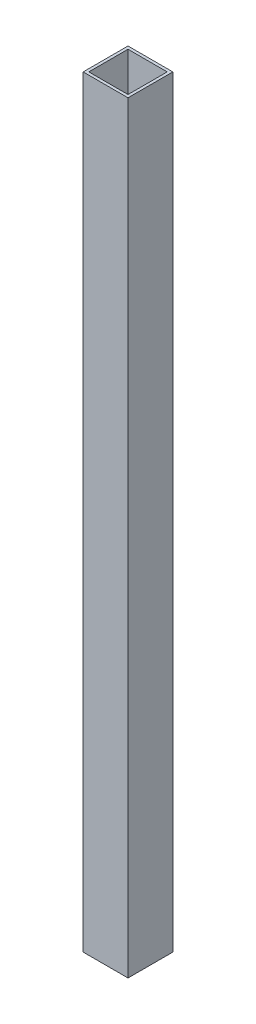
ISO-10303-21;
HEADER;
FILE_DESCRIPTION(('STEP AP214'),'2;1');
FILE_NAME('part.step','',(''),(''),'','','');
FILE_SCHEMA(('AUTOMOTIVE_DESIGN { 1 0 10303 214 1 1 1 1 }'));
ENDSEC;
DATA;
#1=APPLICATION_CONTEXT('core data for automotive mechanical design processes');
#2=APPLICATION_PROTOCOL_DEFINITION('international standard','automotive_design',2000,#1);
#3=PRODUCT_CONTEXT('',#1,'mechanical');
#4=PRODUCT('Part','Part','',(#3));
#5=PRODUCT_RELATED_PRODUCT_CATEGORY('part','',(#4));
#6=PRODUCT_DEFINITION_FORMATION('','',#4);
#7=PRODUCT_DEFINITION_CONTEXT('part definition',#1,'design');
#8=PRODUCT_DEFINITION('design','',#6,#7);
#9=PRODUCT_DEFINITION_SHAPE('','',#8);
#10=(LENGTH_UNIT() NAMED_UNIT(*) SI_UNIT(.MILLI.,.METRE.));
#11=(NAMED_UNIT(*) PLANE_ANGLE_UNIT() SI_UNIT($,.RADIAN.));
#12=(NAMED_UNIT(*) SI_UNIT($,.STERADIAN.) SOLID_ANGLE_UNIT());
#13=UNCERTAINTY_MEASURE_WITH_UNIT(LENGTH_MEASURE(1.E-05),#10,'distance_accuracy_value','');
#14=(GEOMETRIC_REPRESENTATION_CONTEXT(3) GLOBAL_UNCERTAINTY_ASSIGNED_CONTEXT((#13)) GLOBAL_UNIT_ASSIGNED_CONTEXT((#10,
#11,#12)) REPRESENTATION_CONTEXT('',''));
#15=CARTESIAN_POINT('',(0.,0.,0.));
#16=DIRECTION('',(0.,0.,1.));
#17=DIRECTION('',(1.,0.,0.));
#18=AXIS2_PLACEMENT_3D('',#15,#16,#17);
#19=CARTESIAN_POINT('',(1.66533453693773E-13,431.8,0.));
#20=DIRECTION('',(0.,-1.,0.));
#21=DIRECTION('',(0.,0.,-1.));
#22=AXIS2_PLACEMENT_3D('',#19,#20,#21);
#23=PLANE('',#22);
#24=DIRECTION('',(0.,0.,1.));
#25=VECTOR('',#24,1.);
#26=CARTESIAN_POINT('',(-12.6999999999999,431.8,-12.6999999999999));
#27=LINE('',#26,#25);
#28=CARTESIAN_POINT('',(-12.6999999999999,431.8,-12.6999999999999));
#29=VERTEX_POINT('',#28);
#30=CARTESIAN_POINT('',(-12.7,431.8,12.7000000000002));
#31=VERTEX_POINT('',#30);
#32=EDGE_CURVE('E131',#29,#31,#27,.T.);
#33=ORIENTED_EDGE('',*,*,#32,.T.);
#34=DIRECTION('',(0.999999999999999,0.,0.));
#35=VECTOR('',#34,1.);
#36=CARTESIAN_POINT('',(12.7,431.8,12.7000000000002));
#37=LINE('',#36,#35);
#38=CARTESIAN_POINT('',(12.7,431.8,12.7000000000002));
#39=VERTEX_POINT('',#38);
#40=EDGE_CURVE('E134',#31,#39,#37,.T.);
#41=ORIENTED_EDGE('',*,*,#40,.T.);
#42=DIRECTION('',(0.,0.,-1.));
#43=VECTOR('',#42,1.);
#44=CARTESIAN_POINT('',(12.7,431.8,-12.6999999999999));
#45=LINE('',#44,#43);
#46=CARTESIAN_POINT('',(12.7,431.8,-12.6999999999999));
#47=VERTEX_POINT('',#46);
#48=EDGE_CURVE('E137',#39,#47,#45,.T.);
#49=ORIENTED_EDGE('',*,*,#48,.T.);
#50=DIRECTION('',(-0.999999999999999,0.,0.));
#51=VECTOR('',#50,1.);
#52=CARTESIAN_POINT('',(12.7,431.8,-12.6999999999999));
#53=LINE('',#52,#51);
#54=EDGE_CURVE('E139',#47,#29,#53,.T.);
#55=ORIENTED_EDGE('',*,*,#54,.T.);
#56=EDGE_LOOP('',(#33,#41,#49,#55));
#57=FACE_BOUND('',#56,.T.);
#58=DIRECTION('',(0.,0.,1.));
#59=VECTOR('',#58,1.);
#60=CARTESIAN_POINT('',(-11.1124999999999,431.8,-11.1124999999999));
#61=LINE('',#60,#59);
#62=CARTESIAN_POINT('',(-11.1124999999999,431.8,-11.1124999999999));
#63=VERTEX_POINT('',#62);
#64=CARTESIAN_POINT('',(-11.1125,431.8,11.1125000000001));
#65=VERTEX_POINT('',#64);
#66=EDGE_CURVE('E95',#63,#65,#61,.T.);
#67=ORIENTED_EDGE('',*,*,#66,.F.);
#68=DIRECTION('',(-0.999999999999999,0.,0.));
#69=VECTOR('',#68,1.);
#70=CARTESIAN_POINT('',(11.1125,431.8,-11.1124999999999));
#71=LINE('',#70,#69);
#72=CARTESIAN_POINT('',(11.1125,431.8,-11.1124999999999));
#73=VERTEX_POINT('',#72);
#74=EDGE_CURVE('E117',#73,#63,#71,.T.);
#75=ORIENTED_EDGE('',*,*,#74,.F.);
#76=DIRECTION('',(0.,0.,-1.));
#77=VECTOR('',#76,1.);
#78=CARTESIAN_POINT('',(11.1125,431.8,-11.1124999999999));
#79=LINE('',#78,#77);
#80=CARTESIAN_POINT('',(11.1125,431.8,11.1125000000001));
#81=VERTEX_POINT('',#80);
#82=EDGE_CURVE('E115',#81,#73,#79,.T.);
#83=ORIENTED_EDGE('',*,*,#82,.F.);
#84=DIRECTION('',(0.999999999999999,0.,0.));
#85=VECTOR('',#84,1.);
#86=CARTESIAN_POINT('',(11.1125,431.8,11.1125000000001));
#87=LINE('',#86,#85);
#88=EDGE_CURVE('E103',#65,#81,#87,.T.);
#89=ORIENTED_EDGE('',*,*,#88,.F.);
#90=EDGE_LOOP('',(#67,#75,#83,#89));
#91=FACE_BOUND('',#90,.T.);
#92=ADVANCED_FACE('F30',(#57,#91),#23,.F.);
#93=CARTESIAN_POINT('',(0.,0.,0.));
#94=DIRECTION('',(0.,-1.,0.));
#95=DIRECTION('',(0.,0.,-1.));
#96=AXIS2_PLACEMENT_3D('',#93,#94,#95);
#97=PLANE('',#96);
#98=DIRECTION('',(0.,0.,1.));
#99=VECTOR('',#98,1.);
#100=CARTESIAN_POINT('',(-12.7,-6.66133814775094E-13,-12.6999999999999));
#101=LINE('',#100,#99);
#102=CARTESIAN_POINT('',(-12.7,-6.66133814775094E-13,-12.6999999999999));
#103=VERTEX_POINT('',#102);
#104=CARTESIAN_POINT('',(-12.7000000000002,0.,12.6999999999999));
#105=VERTEX_POINT('',#104);
#106=EDGE_CURVE('E111',#103,#105,#101,.T.);
#107=ORIENTED_EDGE('',*,*,#106,.F.);
#108=DIRECTION('',(-0.999999999999999,0.,0.));
#109=VECTOR('',#108,1.);
#110=CARTESIAN_POINT('',(12.7,0.,-12.6999999999999));
#111=LINE('',#110,#109);
#112=CARTESIAN_POINT('',(12.7,0.,-12.6999999999999));
#113=VERTEX_POINT('',#112);
#114=EDGE_CURVE('E135',#113,#103,#111,.T.);
#115=ORIENTED_EDGE('',*,*,#114,.F.);
#116=DIRECTION('',(0.,0.,-1.));
#117=VECTOR('',#116,1.);
#118=CARTESIAN_POINT('',(12.7,0.,-12.6999999999999));
#119=LINE('',#118,#117);
#120=CARTESIAN_POINT('',(12.6999999999998,0.,12.6999999999999));
#121=VERTEX_POINT('',#120);
#122=EDGE_CURVE('E146',#121,#113,#119,.T.);
#123=ORIENTED_EDGE('',*,*,#122,.F.);
#124=DIRECTION('',(0.999999999999999,0.,0.));
#125=VECTOR('',#124,1.);
#126=CARTESIAN_POINT('',(12.6999999999998,0.,12.6999999999999));
#127=LINE('',#126,#125);
#128=EDGE_CURVE('E144',#105,#121,#127,.T.);
#129=ORIENTED_EDGE('',*,*,#128,.F.);
#130=EDGE_LOOP('',(#107,#115,#123,#129));
#131=FACE_BOUND('',#130,.T.);
#132=DIRECTION('',(-0.999999999999999,0.,0.));
#133=VECTOR('',#132,1.);
#134=CARTESIAN_POINT('',(11.1125,0.,-11.1125000000001));
#135=LINE('',#134,#133);
#136=CARTESIAN_POINT('',(11.1125,0.,-11.1125000000001));
#137=VERTEX_POINT('',#136);
#138=CARTESIAN_POINT('',(-11.1125,0.,-11.1125000000001));
#139=VERTEX_POINT('',#138);
#140=EDGE_CURVE('E104',#137,#139,#135,.T.);
#141=ORIENTED_EDGE('',*,*,#140,.T.);
#142=DIRECTION('',(0.,0.,1.));
#143=VECTOR('',#142,1.);
#144=CARTESIAN_POINT('',(-11.1125,0.,-11.1125000000001));
#145=LINE('',#144,#143);
#146=CARTESIAN_POINT('',(-11.1125000000002,0.,11.1125000000001));
#147=VERTEX_POINT('',#146);
#148=EDGE_CURVE('E53',#139,#147,#145,.T.);
#149=ORIENTED_EDGE('',*,*,#148,.T.);
#150=DIRECTION('',(0.999999999999999,0.,0.));
#151=VECTOR('',#150,1.);
#152=CARTESIAN_POINT('',(11.1124999999998,0.,11.1125000000001));
#153=LINE('',#152,#151);
#154=CARTESIAN_POINT('',(11.1124999999998,0.,11.1125000000001));
#155=VERTEX_POINT('',#154);
#156=EDGE_CURVE('E110',#147,#155,#153,.T.);
#157=ORIENTED_EDGE('',*,*,#156,.T.);
#158=DIRECTION('',(0.,0.,-1.));
#159=VECTOR('',#158,1.);
#160=CARTESIAN_POINT('',(11.1125,0.,-11.1125000000001));
#161=LINE('',#160,#159);
#162=EDGE_CURVE('E123',#155,#137,#161,.T.);
#163=ORIENTED_EDGE('',*,*,#162,.T.);
#164=EDGE_LOOP('',(#141,#149,#157,#163));
#165=FACE_BOUND('',#164,.T.);
#166=ADVANCED_FACE('F164',(#131,#165),#97,.T.);
#167=CARTESIAN_POINT('',(-12.6999999999999,431.8,-12.6999999999999));
#168=DIRECTION('',(0.999999999999999,0.,0.));
#169=DIRECTION('',(0.,0.,-1.));
#170=AXIS2_PLACEMENT_3D('',#167,#168,#169);
#171=PLANE('',#170);
#172=ORIENTED_EDGE('',*,*,#106,.T.);
#173=DIRECTION('',(0.,-1.,0.));
#174=VECTOR('',#173,1.);
#175=CARTESIAN_POINT('',(-12.7,431.8,12.7000000000002));
#176=LINE('',#175,#174);
#177=EDGE_CURVE('E11',#31,#105,#176,.T.);
#178=ORIENTED_EDGE('',*,*,#177,.F.);
#179=ORIENTED_EDGE('',*,*,#32,.F.);
#180=DIRECTION('',(0.,-1.,0.));
#181=VECTOR('',#180,1.);
#182=CARTESIAN_POINT('',(-12.6999999999999,431.8,-12.6999999999999));
#183=LINE('',#182,#181);
#184=EDGE_CURVE('E141',#29,#103,#183,.T.);
#185=ORIENTED_EDGE('',*,*,#184,.T.);
#186=EDGE_LOOP('',(#172,#178,#179,#185));
#187=FACE_BOUND('',#186,.T.);
#188=ADVANCED_FACE('F32',(#187),#171,.F.);
#189=CARTESIAN_POINT('',(12.7,431.8,12.7000000000002));
#190=DIRECTION('',(0.,0.,-1.));
#191=DIRECTION('',(-0.999999999999999,0.,0.));
#192=AXIS2_PLACEMENT_3D('',#189,#190,#191);
#193=PLANE('',#192);
#194=ORIENTED_EDGE('',*,*,#128,.T.);
#195=DIRECTION('',(0.,-1.,0.));
#196=VECTOR('',#195,1.);
#197=CARTESIAN_POINT('',(12.7,431.8,12.7000000000002));
#198=LINE('',#197,#196);
#199=EDGE_CURVE('E38',#39,#121,#198,.T.);
#200=ORIENTED_EDGE('',*,*,#199,.F.);
#201=ORIENTED_EDGE('',*,*,#40,.F.);
#202=ORIENTED_EDGE('',*,*,#177,.T.);
#203=EDGE_LOOP('',(#194,#200,#201,#202));
#204=FACE_BOUND('',#203,.T.);
#205=ADVANCED_FACE('F174',(#204),#193,.F.);
#206=CARTESIAN_POINT('',(12.7,431.8,-12.6999999999999));
#207=DIRECTION('',(-0.999999999999999,0.,0.));
#208=DIRECTION('',(0.,0.,1.));
#209=AXIS2_PLACEMENT_3D('',#206,#207,#208);
#210=PLANE('',#209);
#211=ORIENTED_EDGE('',*,*,#122,.T.);
#212=DIRECTION('',(0.,-1.,0.));
#213=VECTOR('',#212,1.);
#214=CARTESIAN_POINT('',(12.7,431.8,-12.6999999999999));
#215=LINE('',#214,#213);
#216=EDGE_CURVE('E151',#47,#113,#215,.T.);
#217=ORIENTED_EDGE('',*,*,#216,.F.);
#218=ORIENTED_EDGE('',*,*,#48,.F.);
#219=ORIENTED_EDGE('',*,*,#199,.T.);
#220=EDGE_LOOP('',(#211,#217,#218,#219));
#221=FACE_BOUND('',#220,.T.);
#222=ADVANCED_FACE('F158',(#221),#210,.F.);
#223=CARTESIAN_POINT('',(12.7,431.8,-12.6999999999999));
#224=DIRECTION('',(0.,0.,1.));
#225=DIRECTION('',(0.999999999999999,0.,0.));
#226=AXIS2_PLACEMENT_3D('',#223,#224,#225);
#227=PLANE('',#226);
#228=ORIENTED_EDGE('',*,*,#114,.T.);
#229=ORIENTED_EDGE('',*,*,#184,.F.);
#230=ORIENTED_EDGE('',*,*,#54,.F.);
#231=ORIENTED_EDGE('',*,*,#216,.T.);
#232=EDGE_LOOP('',(#228,#229,#230,#231));
#233=FACE_BOUND('',#232,.T.);
#234=ADVANCED_FACE('F168',(#233),#227,.F.);
#235=CARTESIAN_POINT('',(-11.1124999999999,431.8,-11.1124999999999));
#236=DIRECTION('',(0.999999999999999,0.,0.));
#237=DIRECTION('',(0.,0.,-1.));
#238=AXIS2_PLACEMENT_3D('',#235,#236,#237);
#239=PLANE('',#238);
#240=ORIENTED_EDGE('',*,*,#148,.F.);
#241=DIRECTION('',(0.,-1.,0.));
#242=VECTOR('',#241,1.);
#243=CARTESIAN_POINT('',(-11.1124999999999,431.8,-11.1124999999999));
#244=LINE('',#243,#242);
#245=EDGE_CURVE('E99',#63,#139,#244,.T.);
#246=ORIENTED_EDGE('',*,*,#245,.F.);
#247=ORIENTED_EDGE('',*,*,#66,.T.);
#248=DIRECTION('',(0.,-1.,0.));
#249=VECTOR('',#248,1.);
#250=CARTESIAN_POINT('',(-11.1125,431.8,11.1125000000001));
#251=LINE('',#250,#249);
#252=EDGE_CURVE('E98',#65,#147,#251,.T.);
#253=ORIENTED_EDGE('',*,*,#252,.T.);
#254=EDGE_LOOP('',(#240,#246,#247,#253));
#255=FACE_BOUND('',#254,.T.);
#256=ADVANCED_FACE('F97',(#255),#239,.T.);
#257=CARTESIAN_POINT('',(11.1125,431.8,11.1125000000001));
#258=DIRECTION('',(0.,0.,-1.));
#259=DIRECTION('',(-0.999999999999999,0.,0.));
#260=AXIS2_PLACEMENT_3D('',#257,#258,#259);
#261=PLANE('',#260);
#262=ORIENTED_EDGE('',*,*,#156,.F.);
#263=ORIENTED_EDGE('',*,*,#252,.F.);
#264=ORIENTED_EDGE('',*,*,#88,.T.);
#265=DIRECTION('',(0.,-1.,0.));
#266=VECTOR('',#265,1.);
#267=CARTESIAN_POINT('',(11.1125,431.8,11.1125000000001));
#268=LINE('',#267,#266);
#269=EDGE_CURVE('E112',#81,#155,#268,.T.);
#270=ORIENTED_EDGE('',*,*,#269,.T.);
#271=EDGE_LOOP('',(#262,#263,#264,#270));
#272=FACE_BOUND('',#271,.T.);
#273=ADVANCED_FACE('F107',(#272),#261,.T.);
#274=CARTESIAN_POINT('',(11.1125,431.8,-11.1124999999999));
#275=DIRECTION('',(-0.999999999999999,0.,0.));
#276=DIRECTION('',(0.,0.,1.));
#277=AXIS2_PLACEMENT_3D('',#274,#275,#276);
#278=PLANE('',#277);
#279=ORIENTED_EDGE('',*,*,#162,.F.);
#280=ORIENTED_EDGE('',*,*,#269,.F.);
#281=ORIENTED_EDGE('',*,*,#82,.T.);
#282=DIRECTION('',(0.,-1.,0.));
#283=VECTOR('',#282,1.);
#284=CARTESIAN_POINT('',(11.1125,431.8,-11.1124999999999));
#285=LINE('',#284,#283);
#286=EDGE_CURVE('E45',#73,#137,#285,.T.);
#287=ORIENTED_EDGE('',*,*,#286,.T.);
#288=EDGE_LOOP('',(#279,#280,#281,#287));
#289=FACE_BOUND('',#288,.T.);
#290=ADVANCED_FACE('F197',(#289),#278,.T.);
#291=CARTESIAN_POINT('',(11.1125,431.8,-11.1124999999999));
#292=DIRECTION('',(0.,0.,1.));
#293=DIRECTION('',(0.999999999999999,0.,0.));
#294=AXIS2_PLACEMENT_3D('',#291,#292,#293);
#295=PLANE('',#294);
#296=ORIENTED_EDGE('',*,*,#140,.F.);
#297=ORIENTED_EDGE('',*,*,#286,.F.);
#298=ORIENTED_EDGE('',*,*,#74,.T.);
#299=ORIENTED_EDGE('',*,*,#245,.T.);
#300=EDGE_LOOP('',(#296,#297,#298,#299));
#301=FACE_BOUND('',#300,.T.);
#302=ADVANCED_FACE('F201',(#301),#295,.T.);
#303=CLOSED_SHELL('',(#92,#166,#188,#205,#222,#234,#256,#273,#290,#302));
#304=MANIFOLD_SOLID_BREP('B2',#303);
#305=ADVANCED_BREP_SHAPE_REPRESENTATION('',(#18,#304),#14);
#306=SHAPE_DEFINITION_REPRESENTATION(#9,#305);
ENDSEC;
END-ISO-10303-21;
